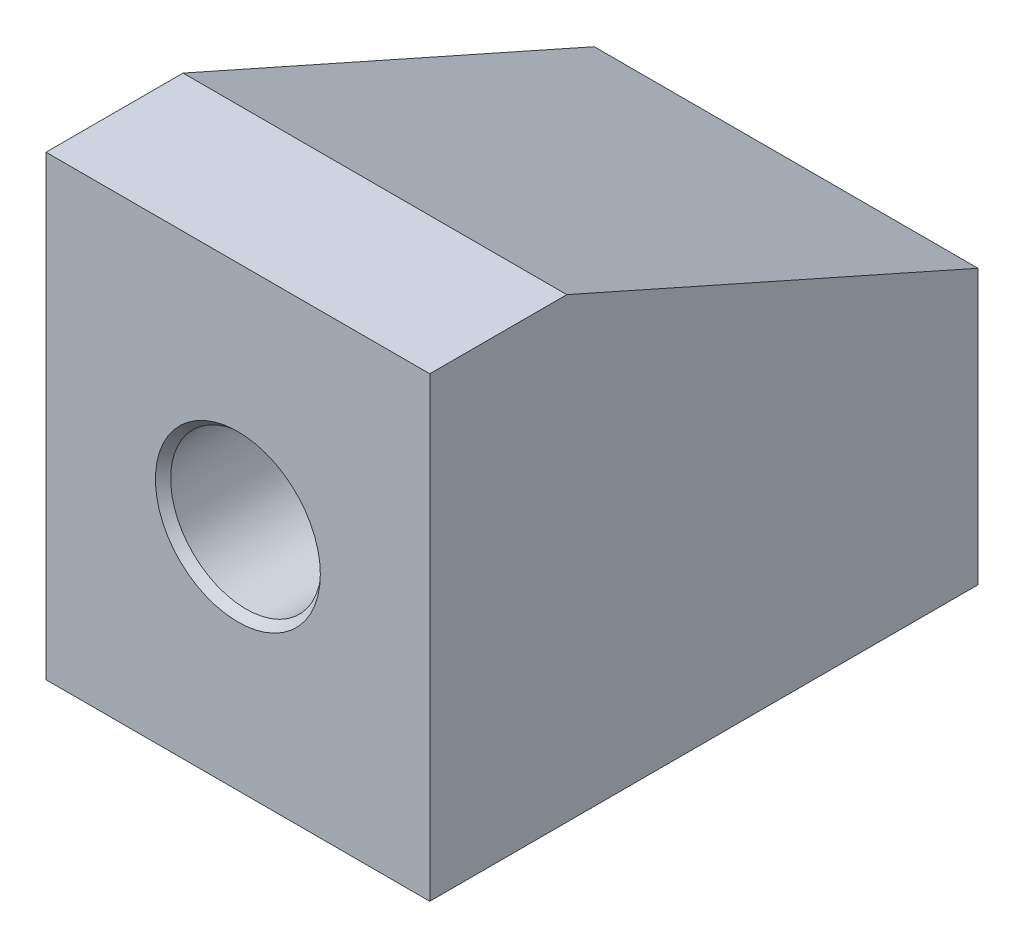
ISO-10303-21;
HEADER;
FILE_DESCRIPTION(('STEP AP214'),'2;1');
FILE_NAME('part.step','',(''),(''),'','','');
FILE_SCHEMA(('AUTOMOTIVE_DESIGN { 1 0 10303 214 1 1 1 1 }'));
ENDSEC;
DATA;
#1=APPLICATION_CONTEXT('core data for automotive mechanical design processes');
#2=APPLICATION_PROTOCOL_DEFINITION('international standard','automotive_design',2000,#1);
#3=PRODUCT_CONTEXT('',#1,'mechanical');
#4=PRODUCT('Part','Part','',(#3));
#5=PRODUCT_RELATED_PRODUCT_CATEGORY('part','',(#4));
#6=PRODUCT_DEFINITION_FORMATION('','',#4);
#7=PRODUCT_DEFINITION_CONTEXT('part definition',#1,'design');
#8=PRODUCT_DEFINITION('design','',#6,#7);
#9=PRODUCT_DEFINITION_SHAPE('','',#8);
#10=(LENGTH_UNIT() NAMED_UNIT(*) SI_UNIT(.MILLI.,.METRE.));
#11=(NAMED_UNIT(*) PLANE_ANGLE_UNIT() SI_UNIT($,.RADIAN.));
#12=(NAMED_UNIT(*) SI_UNIT($,.STERADIAN.) SOLID_ANGLE_UNIT());
#13=UNCERTAINTY_MEASURE_WITH_UNIT(LENGTH_MEASURE(1.E-05),#10,'distance_accuracy_value','');
#14=(GEOMETRIC_REPRESENTATION_CONTEXT(3) GLOBAL_UNCERTAINTY_ASSIGNED_CONTEXT((#13)) GLOBAL_UNIT_ASSIGNED_CONTEXT((#10,
#11,#12)) REPRESENTATION_CONTEXT('',''));
#15=CARTESIAN_POINT('',(0.,0.,0.));
#16=DIRECTION('',(0.,0.,1.));
#17=DIRECTION('',(1.,0.,0.));
#18=AXIS2_PLACEMENT_3D('',#15,#16,#17);
#19=CARTESIAN_POINT('',(42.,0.,30.));
#20=DIRECTION('',(0.,1.,0.));
#21=DIRECTION('',(0.,0.,1.));
#22=AXIS2_PLACEMENT_3D('',#19,#20,#21);
#23=PLANE('',#22);
#24=DIRECTION('',(0.,0.,-1.));
#25=VECTOR('',#24,1.);
#26=CARTESIAN_POINT('',(0.,0.,30.));
#27=LINE('',#26,#25);
#28=CARTESIAN_POINT('',(0.,0.,30.));
#29=VERTEX_POINT('',#28);
#30=CARTESIAN_POINT('',(0.,0.,-30.));
#31=VERTEX_POINT('',#30);
#32=EDGE_CURVE('E120',#29,#31,#27,.T.);
#33=ORIENTED_EDGE('',*,*,#32,.T.);
#34=DIRECTION('',(-1.,0.,0.));
#35=VECTOR('',#34,1.);
#36=CARTESIAN_POINT('',(42.,0.,-30.));
#37=LINE('',#36,#35);
#38=CARTESIAN_POINT('',(42.,0.,-30.));
#39=VERTEX_POINT('',#38);
#40=EDGE_CURVE('E11',#39,#31,#37,.T.);
#41=ORIENTED_EDGE('',*,*,#40,.F.);
#42=DIRECTION('',(0.,0.,-1.));
#43=VECTOR('',#42,1.);
#44=CARTESIAN_POINT('',(42.,0.,30.));
#45=LINE('',#44,#43);
#46=CARTESIAN_POINT('',(42.,0.,30.));
#47=VERTEX_POINT('',#46);
#48=EDGE_CURVE('E129',#47,#39,#45,.T.);
#49=ORIENTED_EDGE('',*,*,#48,.F.);
#50=DIRECTION('',(-1.,0.,0.));
#51=VECTOR('',#50,1.);
#52=CARTESIAN_POINT('',(42.,0.,30.));
#53=LINE('',#52,#51);
#54=EDGE_CURVE('E116',#47,#29,#53,.T.);
#55=ORIENTED_EDGE('',*,*,#54,.T.);
#56=EDGE_LOOP('',(#33,#41,#49,#55));
#57=FACE_BOUND('',#56,.T.);
#58=ADVANCED_FACE('F44',(#57),#23,.F.);
#59=CARTESIAN_POINT('',(42.,0.,-30.));
#60=DIRECTION('',(0.,0.,1.));
#61=DIRECTION('',(0.,-1.,0.));
#62=AXIS2_PLACEMENT_3D('',#59,#60,#61);
#63=PLANE('',#62);
#64=DIRECTION('',(0.,1.,0.));
#65=VECTOR('',#64,1.);
#66=CARTESIAN_POINT('',(0.,0.,-30.));
#67=LINE('',#66,#65);
#68=CARTESIAN_POINT('',(0.,30.,-30.));
#69=VERTEX_POINT('',#68);
#70=EDGE_CURVE('E123',#31,#69,#67,.T.);
#71=ORIENTED_EDGE('',*,*,#70,.T.);
#72=DIRECTION('',(-1.,0.,0.));
#73=VECTOR('',#72,1.);
#74=CARTESIAN_POINT('',(42.,30.,-30.));
#75=LINE('',#74,#73);
#76=CARTESIAN_POINT('',(42.,30.,-30.));
#77=VERTEX_POINT('',#76);
#78=EDGE_CURVE('E52',#77,#69,#75,.T.);
#79=ORIENTED_EDGE('',*,*,#78,.F.);
#80=DIRECTION('',(0.,1.,0.));
#81=VECTOR('',#80,1.);
#82=CARTESIAN_POINT('',(42.,0.,-30.));
#83=LINE('',#82,#81);
#84=EDGE_CURVE('E95',#39,#77,#83,.T.);
#85=ORIENTED_EDGE('',*,*,#84,.F.);
#86=ORIENTED_EDGE('',*,*,#40,.T.);
#87=EDGE_LOOP('',(#71,#79,#85,#86));
#88=FACE_BOUND('',#87,.T.);
#89=ADVANCED_FACE('F150',(#88),#63,.F.);
#90=CARTESIAN_POINT('',(42.,30.,-30.));
#91=DIRECTION('',(0.,-0.913811548620257,0.406138466053447));
#92=DIRECTION('',(0.,-0.406138466053448,-0.913811548620257));
#93=AXIS2_PLACEMENT_3D('',#90,#91,#92);
#94=PLANE('',#93);
#95=DIRECTION('',(0.,0.406138466053447,0.913811548620257));
#96=VECTOR('',#95,1.);
#97=CARTESIAN_POINT('',(0.,30.,-30.));
#98=LINE('',#97,#96);
#99=CARTESIAN_POINT('',(0.,50.,15.));
#100=VERTEX_POINT('',#99);
#101=EDGE_CURVE('E111',#69,#100,#98,.T.);
#102=ORIENTED_EDGE('',*,*,#101,.T.);
#103=DIRECTION('',(-1.,0.,0.));
#104=VECTOR('',#103,1.);
#105=CARTESIAN_POINT('',(42.,50.,15.));
#106=LINE('',#105,#104);
#107=CARTESIAN_POINT('',(42.,50.,15.));
#108=VERTEX_POINT('',#107);
#109=EDGE_CURVE('E108',#108,#100,#106,.T.);
#110=ORIENTED_EDGE('',*,*,#109,.F.);
#111=DIRECTION('',(0.,0.406138466053447,0.913811548620257));
#112=VECTOR('',#111,1.);
#113=CARTESIAN_POINT('',(42.,30.,-30.));
#114=LINE('',#113,#112);
#115=EDGE_CURVE('E100',#77,#108,#114,.T.);
#116=ORIENTED_EDGE('',*,*,#115,.F.);
#117=ORIENTED_EDGE('',*,*,#78,.T.);
#118=EDGE_LOOP('',(#102,#110,#116,#117));
#119=FACE_BOUND('',#118,.T.);
#120=ADVANCED_FACE('F109',(#119),#94,.F.);
#121=CARTESIAN_POINT('',(42.,50.,15.));
#122=DIRECTION('',(0.,-1.,0.));
#123=DIRECTION('',(0.,0.,-1.));
#124=AXIS2_PLACEMENT_3D('',#121,#122,#123);
#125=PLANE('',#124);
#126=DIRECTION('',(0.,0.,1.));
#127=VECTOR('',#126,1.);
#128=CARTESIAN_POINT('',(0.,50.,15.));
#129=LINE('',#128,#127);
#130=CARTESIAN_POINT('',(0.,50.,30.));
#131=VERTEX_POINT('',#130);
#132=EDGE_CURVE('E81',#100,#131,#129,.T.);
#133=ORIENTED_EDGE('',*,*,#132,.T.);
#134=DIRECTION('',(-1.,0.,0.));
#135=VECTOR('',#134,1.);
#136=CARTESIAN_POINT('',(42.,50.,30.));
#137=LINE('',#136,#135);
#138=CARTESIAN_POINT('',(42.,50.,30.));
#139=VERTEX_POINT('',#138);
#140=EDGE_CURVE('E112',#139,#131,#137,.T.);
#141=ORIENTED_EDGE('',*,*,#140,.F.);
#142=DIRECTION('',(0.,0.,1.));
#143=VECTOR('',#142,1.);
#144=CARTESIAN_POINT('',(42.,50.,15.));
#145=LINE('',#144,#143);
#146=EDGE_CURVE('E104',#108,#139,#145,.T.);
#147=ORIENTED_EDGE('',*,*,#146,.F.);
#148=ORIENTED_EDGE('',*,*,#109,.T.);
#149=EDGE_LOOP('',(#133,#141,#147,#148));
#150=FACE_BOUND('',#149,.T.);
#151=ADVANCED_FACE('F114',(#150),#125,.F.);
#152=CARTESIAN_POINT('',(42.,50.,30.));
#153=DIRECTION('',(0.,0.,-1.));
#154=DIRECTION('',(0.,1.,0.));
#155=AXIS2_PLACEMENT_3D('',#152,#153,#154);
#156=PLANE('',#155);
#157=CARTESIAN_POINT('',(21.,25.,30.));
#158=DIRECTION('',(0.,0.,1.));
#159=DIRECTION('',(1.,0.,0.));
#160=AXIS2_PLACEMENT_3D('',#157,#158,#159);
#161=CIRCLE('',#160,9.025);
#162=CARTESIAN_POINT('',(30.025,25.,30.));
#163=VERTEX_POINT('',#162);
#164=EDGE_CURVE('E251',#163,#163,#161,.T.);
#165=ORIENTED_EDGE('',*,*,#164,.F.);
#166=EDGE_LOOP('',(#165));
#167=FACE_BOUND('',#166,.T.);
#168=DIRECTION('',(0.,-1.,0.));
#169=VECTOR('',#168,1.);
#170=CARTESIAN_POINT('',(0.,50.,30.));
#171=LINE('',#170,#169);
#172=EDGE_CURVE('E87',#131,#29,#171,.T.);
#173=ORIENTED_EDGE('',*,*,#172,.T.);
#174=ORIENTED_EDGE('',*,*,#54,.F.);
#175=DIRECTION('',(0.,-1.,0.));
#176=VECTOR('',#175,1.);
#177=CARTESIAN_POINT('',(42.,50.,30.));
#178=LINE('',#177,#176);
#179=EDGE_CURVE('E60',#139,#47,#178,.T.);
#180=ORIENTED_EDGE('',*,*,#179,.F.);
#181=ORIENTED_EDGE('',*,*,#140,.T.);
#182=EDGE_LOOP('',(#173,#174,#180,#181));
#183=FACE_BOUND('',#182,.T.);
#184=ADVANCED_FACE('F137',(#167,#183),#156,.F.);
#185=CARTESIAN_POINT('',(42.,0.,0.));
#186=DIRECTION('',(1.,0.,0.));
#187=DIRECTION('',(0.,0.,-1.));
#188=AXIS2_PLACEMENT_3D('',#185,#186,#187);
#189=PLANE('',#188);
#190=ORIENTED_EDGE('',*,*,#48,.T.);
#191=ORIENTED_EDGE('',*,*,#84,.T.);
#192=ORIENTED_EDGE('',*,*,#115,.T.);
#193=ORIENTED_EDGE('',*,*,#146,.T.);
#194=ORIENTED_EDGE('',*,*,#179,.T.);
#195=EDGE_LOOP('',(#190,#191,#192,#193,#194));
#196=FACE_BOUND('',#195,.T.);
#197=ADVANCED_FACE('F102',(#196),#189,.T.);
#198=CARTESIAN_POINT('',(0.,0.,0.));
#199=DIRECTION('',(1.,0.,0.));
#200=DIRECTION('',(0.,0.,-1.));
#201=AXIS2_PLACEMENT_3D('',#198,#199,#200);
#202=PLANE('',#201);
#203=ORIENTED_EDGE('',*,*,#32,.F.);
#204=ORIENTED_EDGE('',*,*,#172,.F.);
#205=ORIENTED_EDGE('',*,*,#132,.F.);
#206=ORIENTED_EDGE('',*,*,#101,.F.);
#207=ORIENTED_EDGE('',*,*,#70,.F.);
#208=EDGE_LOOP('',(#203,#204,#205,#206,#207));
#209=FACE_BOUND('',#208,.T.);
#210=ADVANCED_FACE('F133',(#209),#202,.F.);
#211=CARTESIAN_POINT('',(21.,25.,-8.54289989302263));
#212=DIRECTION('',(0.,0.,1.));
#213=DIRECTION('',(1.,0.,0.));
#214=AXIS2_PLACEMENT_3D('',#211,#212,#213);
#215=CONICAL_SURFACE('',#214,8.24999999999999,1.02974425867665);
#216=CARTESIAN_POINT('',(21.,25.,-13.5));
#217=VERTEX_POINT('',#216);
#218=VERTEX_LOOP('',#217);
#219=FACE_BOUND('',#218,.T.);
#220=CARTESIAN_POINT('',(21.,25.,-8.54289989302263));
#221=DIRECTION('',(0.,0.,1.));
#222=DIRECTION('',(1.,0.,0.));
#223=AXIS2_PLACEMENT_3D('',#220,#221,#222);
#224=CIRCLE('',#223,8.24999999999999);
#225=CARTESIAN_POINT('',(29.25,25.,-8.54289989302263));
#226=VERTEX_POINT('',#225);
#227=EDGE_CURVE('E124',#226,#226,#224,.T.);
#228=ORIENTED_EDGE('',*,*,#227,.T.);
#229=EDGE_LOOP('',(#228));
#230=FACE_BOUND('',#229,.T.);
#231=ADVANCED_FACE('F181',(#219,#230),#215,.F.);
#232=CARTESIAN_POINT('',(21.,25.,30.));
#233=DIRECTION('',(0.,0.,1.));
#234=DIRECTION('',(1.,0.,0.));
#235=AXIS2_PLACEMENT_3D('',#232,#233,#234);
#236=CYLINDRICAL_SURFACE('',#235,8.24999999999999);
#237=ORIENTED_EDGE('',*,*,#227,.F.);
#238=EDGE_LOOP('',(#237));
#239=FACE_BOUND('',#238,.T.);
#240=CARTESIAN_POINT('',(21.,25.,29.1084644844037));
#241=DIRECTION('',(0.,0.,1.));
#242=DIRECTION('',(1.,0.,0.));
#243=AXIS2_PLACEMENT_3D('',#240,#241,#242);
#244=CIRCLE('',#243,8.25);
#245=CARTESIAN_POINT('',(29.25,25.,29.1084644844037));
#246=VERTEX_POINT('',#245);
#247=EDGE_CURVE('E248',#246,#246,#244,.T.);
#248=ORIENTED_EDGE('',*,*,#247,.T.);
#249=EDGE_LOOP('',(#248));
#250=FACE_BOUND('',#249,.T.);
#251=ADVANCED_FACE('F190',(#239,#250),#236,.F.);
#252=CARTESIAN_POINT('',(21.,25.,30.));
#253=DIRECTION('',(0.,0.,1.));
#254=DIRECTION('',(1.,0.,0.));
#255=AXIS2_PLACEMENT_3D('',#252,#253,#254);
#256=CONICAL_SURFACE('',#255,9.025,0.715584993317676);
#257=ORIENTED_EDGE('',*,*,#247,.F.);
#258=EDGE_LOOP('',(#257));
#259=FACE_BOUND('',#258,.T.);
#260=ORIENTED_EDGE('',*,*,#164,.T.);
#261=EDGE_LOOP('',(#260));
#262=FACE_BOUND('',#261,.T.);
#263=ADVANCED_FACE('F186',(#259,#262),#256,.F.);
#264=CLOSED_SHELL('',(#58,#89,#120,#151,#184,#197,#210,#231,#251,#263));
#265=MANIFOLD_SOLID_BREP('B2',#264);
#266=ADVANCED_BREP_SHAPE_REPRESENTATION('',(#18,#265),#14);
#267=SHAPE_DEFINITION_REPRESENTATION(#9,#266);
ENDSEC;
END-ISO-10303-21;
